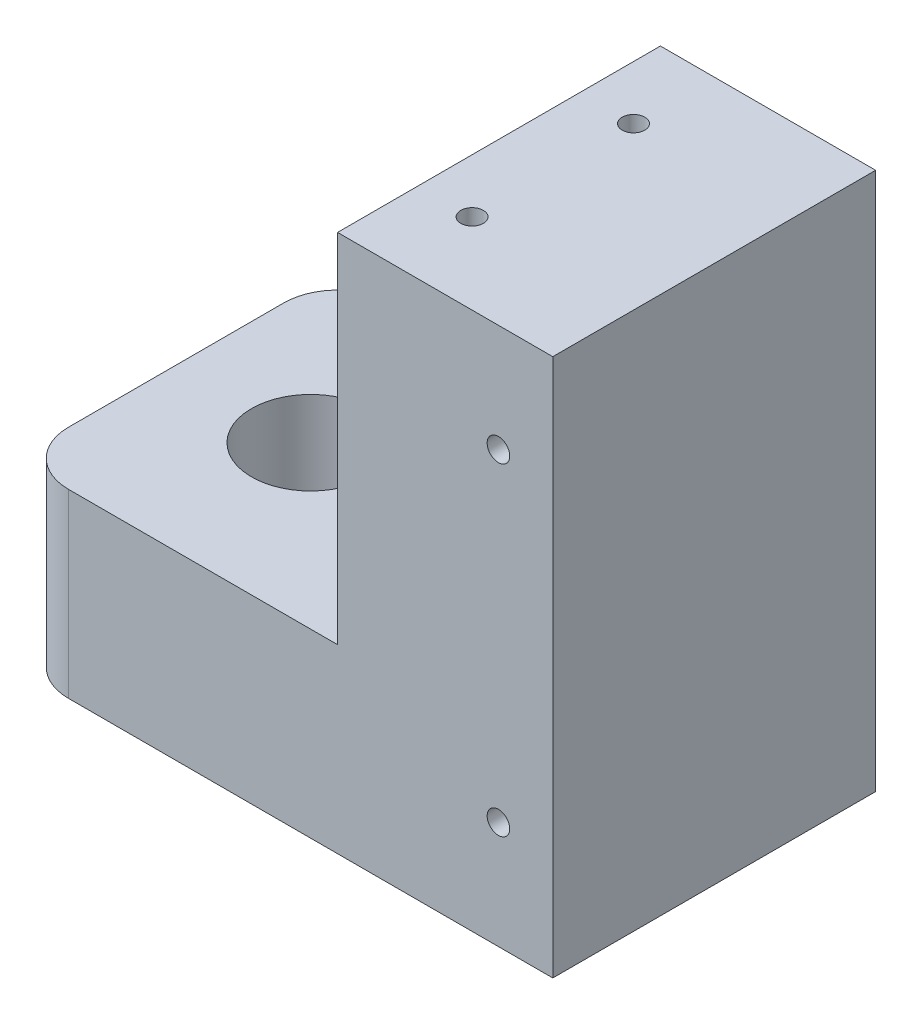
ISO-10303-21;
HEADER;
FILE_DESCRIPTION(('STEP AP214'),'2;1');
FILE_NAME('part.step','',(''),(''),'','','');
FILE_SCHEMA(('AUTOMOTIVE_DESIGN { 1 0 10303 214 1 1 1 1 }'));
ENDSEC;
DATA;
#1=APPLICATION_CONTEXT('core data for automotive mechanical design processes');
#2=APPLICATION_PROTOCOL_DEFINITION('international standard','automotive_design',2000,#1);
#3=PRODUCT_CONTEXT('',#1,'mechanical');
#4=PRODUCT('Part','Part','',(#3));
#5=PRODUCT_RELATED_PRODUCT_CATEGORY('part','',(#4));
#6=PRODUCT_DEFINITION_FORMATION('','',#4);
#7=PRODUCT_DEFINITION_CONTEXT('part definition',#1,'design');
#8=PRODUCT_DEFINITION('design','',#6,#7);
#9=PRODUCT_DEFINITION_SHAPE('','',#8);
#10=(LENGTH_UNIT() NAMED_UNIT(*) SI_UNIT(.MILLI.,.METRE.));
#11=(NAMED_UNIT(*) PLANE_ANGLE_UNIT() SI_UNIT($,.RADIAN.));
#12=(NAMED_UNIT(*) SI_UNIT($,.STERADIAN.) SOLID_ANGLE_UNIT());
#13=UNCERTAINTY_MEASURE_WITH_UNIT(LENGTH_MEASURE(1.E-05),#10,'distance_accuracy_value','');
#14=(GEOMETRIC_REPRESENTATION_CONTEXT(3) GLOBAL_UNCERTAINTY_ASSIGNED_CONTEXT((#13)) GLOBAL_UNIT_ASSIGNED_CONTEXT((#10,
#11,#12)) REPRESENTATION_CONTEXT('',''));
#15=CARTESIAN_POINT('',(0.,0.,0.));
#16=DIRECTION('',(0.,0.,1.));
#17=DIRECTION('',(1.,0.,0.));
#18=AXIS2_PLACEMENT_3D('',#15,#16,#17);
#19=CARTESIAN_POINT('',(25.,0.,-30.));
#20=DIRECTION('',(0.,1.,0.));
#21=DIRECTION('',(0.,0.,1.));
#22=AXIS2_PLACEMENT_3D('',#19,#20,#21);
#23=CYLINDRICAL_SURFACE('',#22,11.);
#24=CARTESIAN_POINT('',(25.,33.65,-30.));
#25=DIRECTION('',(0.,-1.,0.));
#26=DIRECTION('',(0.,0.,-1.));
#27=AXIS2_PLACEMENT_3D('',#24,#25,#26);
#28=CIRCLE('',#27,11.);
#29=CARTESIAN_POINT('',(25.,33.65,-41.));
#30=VERTEX_POINT('',#29);
#31=EDGE_CURVE('E232',#30,#30,#28,.T.);
#32=ORIENTED_EDGE('',*,*,#31,.F.);
#33=EDGE_LOOP('',(#32));
#34=FACE_BOUND('',#33,.T.);
#35=CARTESIAN_POINT('',(25.,10.65,-30.));
#36=DIRECTION('',(0.,-1.,0.));
#37=DIRECTION('',(0.,0.,-1.));
#38=AXIS2_PLACEMENT_3D('',#35,#36,#37);
#39=CIRCLE('',#38,11.);
#40=CARTESIAN_POINT('',(25.,10.65,-41.));
#41=VERTEX_POINT('',#40);
#42=EDGE_CURVE('E278',#41,#41,#39,.F.);
#43=ORIENTED_EDGE('',*,*,#42,.F.);
#44=EDGE_LOOP('',(#43));
#45=FACE_BOUND('',#44,.T.);
#46=ADVANCED_FACE('F45',(#34,#45),#23,.F.);
#47=CARTESIAN_POINT('',(0.,100.,0.));
#48=DIRECTION('',(1.,0.,0.));
#49=DIRECTION('',(0.,0.,-1.));
#50=AXIS2_PLACEMENT_3D('',#47,#48,#49);
#51=PLANE('',#50);
#52=DIRECTION('',(0.,0.,1.));
#53=VECTOR('',#52,1.);
#54=CARTESIAN_POINT('',(0.,0.,0.));
#55=LINE('',#54,#53);
#56=CARTESIAN_POINT('',(0.,0.,-50.));
#57=VERTEX_POINT('',#56);
#58=CARTESIAN_POINT('',(0.,0.,-10.));
#59=VERTEX_POINT('',#58);
#60=EDGE_CURVE('E245',#57,#59,#55,.T.);
#61=ORIENTED_EDGE('',*,*,#60,.T.);
#62=DIRECTION('',(0.,-1.,0.));
#63=VECTOR('',#62,1.);
#64=CARTESIAN_POINT('',(0.,100.,-10.));
#65=LINE('',#64,#63);
#66=CARTESIAN_POINT('',(0.,33.65,-9.99999999999999));
#67=VERTEX_POINT('',#66);
#68=EDGE_CURVE('E68',#59,#67,#65,.F.);
#69=ORIENTED_EDGE('',*,*,#68,.T.);
#70=DIRECTION('',(0.,0.,1.));
#71=VECTOR('',#70,1.);
#72=CARTESIAN_POINT('',(0.,33.65,-100.));
#73=LINE('',#72,#71);
#74=CARTESIAN_POINT('',(0.,33.65,-50.));
#75=VERTEX_POINT('',#74);
#76=EDGE_CURVE('E240',#75,#67,#73,.T.);
#77=ORIENTED_EDGE('',*,*,#76,.F.);
#78=DIRECTION('',(0.,1.,0.));
#79=VECTOR('',#78,1.);
#80=CARTESIAN_POINT('',(0.,100.,-50.));
#81=LINE('',#80,#79);
#82=EDGE_CURVE('E292',#75,#57,#81,.F.);
#83=ORIENTED_EDGE('',*,*,#82,.T.);
#84=EDGE_LOOP('',(#61,#69,#77,#83));
#85=FACE_BOUND('',#84,.T.);
#86=ADVANCED_FACE('F318',(#85),#51,.F.);
#87=CARTESIAN_POINT('',(0.,100.,0.));
#88=DIRECTION('',(0.,0.,-1.));
#89=DIRECTION('',(-1.,0.,0.));
#90=AXIS2_PLACEMENT_3D('',#87,#88,#89);
#91=PLANE('',#90);
#92=CARTESIAN_POINT('',(89.9,80.,0.));
#93=DIRECTION('',(0.,0.,1.));
#94=DIRECTION('',(1.,0.,0.));
#95=AXIS2_PLACEMENT_3D('',#92,#93,#94);
#96=CIRCLE('',#95,2.1);
#97=CARTESIAN_POINT('',(92.,80.,0.));
#98=VERTEX_POINT('',#97);
#99=EDGE_CURVE('E192',#98,#98,#96,.T.);
#100=ORIENTED_EDGE('',*,*,#99,.F.);
#101=EDGE_LOOP('',(#100));
#102=FACE_BOUND('',#101,.T.);
#103=CARTESIAN_POINT('',(89.9,20.,0.));
#104=DIRECTION('',(0.,0.,1.));
#105=DIRECTION('',(1.,0.,0.));
#106=AXIS2_PLACEMENT_3D('',#103,#104,#105);
#107=CIRCLE('',#106,2.1);
#108=CARTESIAN_POINT('',(92.,20.,0.));
#109=VERTEX_POINT('',#108);
#110=EDGE_CURVE('E200',#109,#109,#107,.T.);
#111=ORIENTED_EDGE('',*,*,#110,.F.);
#112=EDGE_LOOP('',(#111));
#113=FACE_BOUND('',#112,.T.);
#114=DIRECTION('',(1.,0.,0.));
#115=VECTOR('',#114,1.);
#116=CARTESIAN_POINT('',(0.,33.65,0.));
#117=LINE('',#116,#115);
#118=CARTESIAN_POINT('',(10.,33.65,0.));
#119=VERTEX_POINT('',#118);
#120=CARTESIAN_POINT('',(60.,33.65,0.));
#121=VERTEX_POINT('',#120);
#122=EDGE_CURVE('E233',#119,#121,#117,.T.);
#123=ORIENTED_EDGE('',*,*,#122,.F.);
#124=DIRECTION('',(0.,-1.,0.));
#125=VECTOR('',#124,1.);
#126=CARTESIAN_POINT('',(10.,100.,0.));
#127=LINE('',#126,#125);
#128=CARTESIAN_POINT('',(10.,0.,0.));
#129=VERTEX_POINT('',#128);
#130=EDGE_CURVE('E282',#119,#129,#127,.T.);
#131=ORIENTED_EDGE('',*,*,#130,.T.);
#132=DIRECTION('',(1.,0.,0.));
#133=VECTOR('',#132,1.);
#134=CARTESIAN_POINT('',(0.,0.,0.));
#135=LINE('',#134,#133);
#136=CARTESIAN_POINT('',(100.,0.,0.));
#137=VERTEX_POINT('',#136);
#138=EDGE_CURVE('E259',#129,#137,#135,.T.);
#139=ORIENTED_EDGE('',*,*,#138,.T.);
#140=DIRECTION('',(0.,-1.,0.));
#141=VECTOR('',#140,1.);
#142=CARTESIAN_POINT('',(100.,100.,0.));
#143=LINE('',#142,#141);
#144=CARTESIAN_POINT('',(100.,100.,0.));
#145=VERTEX_POINT('',#144);
#146=EDGE_CURVE('E256',#145,#137,#143,.T.);
#147=ORIENTED_EDGE('',*,*,#146,.F.);
#148=DIRECTION('',(1.,0.,0.));
#149=VECTOR('',#148,1.);
#150=CARTESIAN_POINT('',(0.,100.,0.));
#151=LINE('',#150,#149);
#152=CARTESIAN_POINT('',(60.,100.,0.));
#153=VERTEX_POINT('',#152);
#154=EDGE_CURVE('E248',#153,#145,#151,.T.);
#155=ORIENTED_EDGE('',*,*,#154,.F.);
#156=DIRECTION('',(0.,1.,0.));
#157=VECTOR('',#156,1.);
#158=CARTESIAN_POINT('',(60.,33.65,0.));
#159=LINE('',#158,#157);
#160=EDGE_CURVE('E236',#121,#153,#159,.T.);
#161=ORIENTED_EDGE('',*,*,#160,.F.);
#162=EDGE_LOOP('',(#123,#131,#139,#147,#155,#161));
#163=FACE_BOUND('',#162,.T.);
#164=ADVANCED_FACE('F308',(#102,#113,#163),#91,.F.);
#165=CARTESIAN_POINT('',(100.,100.,0.));
#166=DIRECTION('',(-1.,0.,0.));
#167=DIRECTION('',(0.,0.,1.));
#168=AXIS2_PLACEMENT_3D('',#165,#166,#167);
#169=PLANE('',#168);
#170=DIRECTION('',(0.,0.,-1.));
#171=VECTOR('',#170,1.);
#172=CARTESIAN_POINT('',(100.,0.,0.));
#173=LINE('',#172,#171);
#174=CARTESIAN_POINT('',(100.,0.,-60.));
#175=VERTEX_POINT('',#174);
#176=EDGE_CURVE('E252',#137,#175,#173,.T.);
#177=ORIENTED_EDGE('',*,*,#176,.T.);
#178=DIRECTION('',(0.,1.,0.));
#179=VECTOR('',#178,1.);
#180=CARTESIAN_POINT('',(100.,100.,-60.));
#181=LINE('',#180,#179);
#182=CARTESIAN_POINT('',(100.,100.,-60.));
#183=VERTEX_POINT('',#182);
#184=EDGE_CURVE('E213',#175,#183,#181,.T.);
#185=ORIENTED_EDGE('',*,*,#184,.T.);
#186=DIRECTION('',(0.,0.,-1.));
#187=VECTOR('',#186,1.);
#188=CARTESIAN_POINT('',(100.,100.,0.));
#189=LINE('',#188,#187);
#190=EDGE_CURVE('E251',#145,#183,#189,.T.);
#191=ORIENTED_EDGE('',*,*,#190,.F.);
#192=ORIENTED_EDGE('',*,*,#146,.T.);
#193=EDGE_LOOP('',(#177,#185,#191,#192));
#194=FACE_BOUND('',#193,.T.);
#195=ADVANCED_FACE('F324',(#194),#169,.F.);
#196=CARTESIAN_POINT('',(0.,100.,0.));
#197=DIRECTION('',(0.,-1.,0.));
#198=DIRECTION('',(0.,0.,-1.));
#199=AXIS2_PLACEMENT_3D('',#196,#197,#198);
#200=PLANE('',#199);
#201=CARTESIAN_POINT('',(70.,100.,-45.));
#202=DIRECTION('',(0.,1.,0.));
#203=DIRECTION('',(0.,0.,1.));
#204=AXIS2_PLACEMENT_3D('',#201,#202,#203);
#205=CIRCLE('',#204,2.09999999999999);
#206=CARTESIAN_POINT('',(70.,100.,-42.9));
#207=VERTEX_POINT('',#206);
#208=EDGE_CURVE('E160',#207,#207,#205,.T.);
#209=ORIENTED_EDGE('',*,*,#208,.F.);
#210=EDGE_LOOP('',(#209));
#211=FACE_BOUND('',#210,.T.);
#212=CARTESIAN_POINT('',(70.,100.,-15.));
#213=DIRECTION('',(0.,1.,0.));
#214=DIRECTION('',(0.,0.,1.));
#215=AXIS2_PLACEMENT_3D('',#212,#213,#214);
#216=CIRCLE('',#215,2.09999999999999);
#217=CARTESIAN_POINT('',(70.,100.,-12.9));
#218=VERTEX_POINT('',#217);
#219=EDGE_CURVE('E168',#218,#218,#216,.T.);
#220=ORIENTED_EDGE('',*,*,#219,.F.);
#221=EDGE_LOOP('',(#220));
#222=FACE_BOUND('',#221,.T.);
#223=ORIENTED_EDGE('',*,*,#190,.T.);
#224=DIRECTION('',(-1.,0.,0.));
#225=VECTOR('',#224,1.);
#226=CARTESIAN_POINT('',(100.,100.,-60.));
#227=LINE('',#226,#225);
#228=CARTESIAN_POINT('',(60.,100.,-60.));
#229=VERTEX_POINT('',#228);
#230=EDGE_CURVE('E221',#183,#229,#227,.T.);
#231=ORIENTED_EDGE('',*,*,#230,.T.);
#232=DIRECTION('',(0.,0.,1.));
#233=VECTOR('',#232,1.);
#234=CARTESIAN_POINT('',(60.,100.,0.));
#235=LINE('',#234,#233);
#236=EDGE_CURVE('E268',#229,#153,#235,.T.);
#237=ORIENTED_EDGE('',*,*,#236,.T.);
#238=ORIENTED_EDGE('',*,*,#154,.T.);
#239=EDGE_LOOP('',(#223,#231,#237,#238));
#240=FACE_BOUND('',#239,.T.);
#241=ADVANCED_FACE('F326',(#211,#222,#240),#200,.F.);
#242=CARTESIAN_POINT('',(0.,0.,0.));
#243=DIRECTION('',(0.,-1.,0.));
#244=DIRECTION('',(0.,0.,-1.));
#245=AXIS2_PLACEMENT_3D('',#242,#243,#244);
#246=PLANE('',#245);
#247=CARTESIAN_POINT('',(70.,0.,-15.));
#248=DIRECTION('',(0.,-1.,0.));
#249=DIRECTION('',(0.,0.,-1.));
#250=AXIS2_PLACEMENT_3D('',#247,#248,#249);
#251=CIRCLE('',#250,3.4);
#252=CARTESIAN_POINT('',(70.,0.,-18.4));
#253=VERTEX_POINT('',#252);
#254=EDGE_CURVE('E147',#253,#253,#251,.T.);
#255=ORIENTED_EDGE('',*,*,#254,.F.);
#256=EDGE_LOOP('',(#255));
#257=FACE_BOUND('',#256,.T.);
#258=CARTESIAN_POINT('',(70.,0.,-45.));
#259=DIRECTION('',(0.,-1.,0.));
#260=DIRECTION('',(0.,0.,-1.));
#261=AXIS2_PLACEMENT_3D('',#258,#259,#260);
#262=CIRCLE('',#261,3.4);
#263=CARTESIAN_POINT('',(70.,0.,-48.4));
#264=VERTEX_POINT('',#263);
#265=EDGE_CURVE('E146',#264,#264,#262,.T.);
#266=ORIENTED_EDGE('',*,*,#265,.F.);
#267=EDGE_LOOP('',(#266));
#268=FACE_BOUND('',#267,.T.);
#269=ORIENTED_EDGE('',*,*,#138,.F.);
#270=CARTESIAN_POINT('',(10.,0.,-10.));
#271=DIRECTION('',(0.,-1.,0.));
#272=DIRECTION('',(0.,0.,-1.));
#273=AXIS2_PLACEMENT_3D('',#270,#271,#272);
#274=CIRCLE('',#273,10.);
#275=EDGE_CURVE('E289',#129,#59,#274,.T.);
#276=ORIENTED_EDGE('',*,*,#275,.T.);
#277=ORIENTED_EDGE('',*,*,#60,.F.);
#278=CARTESIAN_POINT('',(9.99999999999999,0.,-50.));
#279=DIRECTION('',(0.,-1.,0.));
#280=DIRECTION('',(0.,0.,-1.));
#281=AXIS2_PLACEMENT_3D('',#278,#279,#280);
#282=CIRCLE('',#281,10.);
#283=CARTESIAN_POINT('',(9.99999999999999,0.,-60.));
#284=VERTEX_POINT('',#283);
#285=EDGE_CURVE('E286',#57,#284,#282,.T.);
#286=ORIENTED_EDGE('',*,*,#285,.T.);
#287=DIRECTION('',(-1.,0.,0.));
#288=VECTOR('',#287,1.);
#289=CARTESIAN_POINT('',(100.,0.,-60.));
#290=LINE('',#289,#288);
#291=EDGE_CURVE('E220',#175,#284,#290,.T.);
#292=ORIENTED_EDGE('',*,*,#291,.F.);
#293=ORIENTED_EDGE('',*,*,#176,.F.);
#294=EDGE_LOOP('',(#269,#276,#277,#286,#292,#293));
#295=FACE_BOUND('',#294,.T.);
#296=CARTESIAN_POINT('',(25.,0.,-30.));
#297=DIRECTION('',(0.,-1.,0.));
#298=DIRECTION('',(0.,0.,-1.));
#299=AXIS2_PLACEMENT_3D('',#296,#297,#298);
#300=CIRCLE('',#299,7.99999999999998);
#301=CARTESIAN_POINT('',(25.,0.,-38.));
#302=VERTEX_POINT('',#301);
#303=EDGE_CURVE('E208',#302,#302,#300,.T.);
#304=ORIENTED_EDGE('',*,*,#303,.F.);
#305=EDGE_LOOP('',(#304));
#306=FACE_BOUND('',#305,.T.);
#307=ADVANCED_FACE('F314',(#257,#268,#295,#306),#246,.T.);
#308=CARTESIAN_POINT('',(60.,33.65,-100.));
#309=DIRECTION('',(1.,0.,0.));
#310=DIRECTION('',(0.,0.,-1.));
#311=AXIS2_PLACEMENT_3D('',#308,#309,#310);
#312=PLANE('',#311);
#313=ORIENTED_EDGE('',*,*,#236,.F.);
#314=DIRECTION('',(0.,-1.,0.));
#315=VECTOR('',#314,1.);
#316=CARTESIAN_POINT('',(60.,33.65,-60.));
#317=LINE('',#316,#315);
#318=CARTESIAN_POINT('',(60.,33.65,-60.));
#319=VERTEX_POINT('',#318);
#320=EDGE_CURVE('E225',#229,#319,#317,.T.);
#321=ORIENTED_EDGE('',*,*,#320,.T.);
#322=DIRECTION('',(0.,0.,1.));
#323=VECTOR('',#322,1.);
#324=CARTESIAN_POINT('',(60.,33.65,-100.));
#325=LINE('',#324,#323);
#326=EDGE_CURVE('E241',#319,#121,#325,.T.);
#327=ORIENTED_EDGE('',*,*,#326,.T.);
#328=ORIENTED_EDGE('',*,*,#160,.T.);
#329=EDGE_LOOP('',(#313,#321,#327,#328));
#330=FACE_BOUND('',#329,.T.);
#331=ADVANCED_FACE('F330',(#330),#312,.F.);
#332=CARTESIAN_POINT('',(0.,33.65,-100.));
#333=DIRECTION('',(0.,-1.,0.));
#334=DIRECTION('',(0.,0.,-1.));
#335=AXIS2_PLACEMENT_3D('',#332,#333,#334);
#336=PLANE('',#335);
#337=ORIENTED_EDGE('',*,*,#31,.T.);
#338=EDGE_LOOP('',(#337));
#339=FACE_BOUND('',#338,.T.);
#340=ORIENTED_EDGE('',*,*,#76,.T.);
#341=CARTESIAN_POINT('',(10.,33.65,-10.));
#342=DIRECTION('',(0.,-1.,0.));
#343=DIRECTION('',(0.,0.,-1.));
#344=AXIS2_PLACEMENT_3D('',#341,#342,#343);
#345=CIRCLE('',#344,10.);
#346=EDGE_CURVE('E54',#67,#119,#345,.F.);
#347=ORIENTED_EDGE('',*,*,#346,.T.);
#348=ORIENTED_EDGE('',*,*,#122,.T.);
#349=ORIENTED_EDGE('',*,*,#326,.F.);
#350=DIRECTION('',(-1.,0.,0.));
#351=VECTOR('',#350,1.);
#352=CARTESIAN_POINT('',(0.,33.65,-60.));
#353=LINE('',#352,#351);
#354=CARTESIAN_POINT('',(9.99999999999999,33.65,-60.));
#355=VERTEX_POINT('',#354);
#356=EDGE_CURVE('E271',#319,#355,#353,.T.);
#357=ORIENTED_EDGE('',*,*,#356,.T.);
#358=CARTESIAN_POINT('',(9.99999999999999,33.65,-50.));
#359=DIRECTION('',(0.,-1.,0.));
#360=DIRECTION('',(0.,0.,-1.));
#361=AXIS2_PLACEMENT_3D('',#358,#359,#360);
#362=CIRCLE('',#361,10.);
#363=EDGE_CURVE('E61',#355,#75,#362,.F.);
#364=ORIENTED_EDGE('',*,*,#363,.T.);
#365=EDGE_LOOP('',(#340,#347,#348,#349,#357,#364));
#366=FACE_BOUND('',#365,.T.);
#367=ADVANCED_FACE('F302',(#339,#366),#336,.F.);
#368=CARTESIAN_POINT('',(100.,100.,-60.));
#369=DIRECTION('',(0.,0.,1.));
#370=DIRECTION('',(0.,-1.,0.));
#371=AXIS2_PLACEMENT_3D('',#368,#369,#370);
#372=PLANE('',#371);
#373=CARTESIAN_POINT('',(89.9,80.,-60.));
#374=DIRECTION('',(0.,0.,-1.));
#375=DIRECTION('',(-1.,0.,0.));
#376=AXIS2_PLACEMENT_3D('',#373,#374,#375);
#377=CIRCLE('',#376,2.1);
#378=CARTESIAN_POINT('',(87.8,80.,-60.));
#379=VERTEX_POINT('',#378);
#380=EDGE_CURVE('E176',#379,#379,#377,.T.);
#381=ORIENTED_EDGE('',*,*,#380,.F.);
#382=EDGE_LOOP('',(#381));
#383=FACE_BOUND('',#382,.T.);
#384=CARTESIAN_POINT('',(89.9,20.,-60.));
#385=DIRECTION('',(0.,0.,-1.));
#386=DIRECTION('',(-1.,0.,0.));
#387=AXIS2_PLACEMENT_3D('',#384,#385,#386);
#388=CIRCLE('',#387,2.1);
#389=CARTESIAN_POINT('',(87.8,20.,-60.));
#390=VERTEX_POINT('',#389);
#391=EDGE_CURVE('E184',#390,#390,#388,.T.);
#392=ORIENTED_EDGE('',*,*,#391,.F.);
#393=EDGE_LOOP('',(#392));
#394=FACE_BOUND('',#393,.T.);
#395=ORIENTED_EDGE('',*,*,#291,.T.);
#396=DIRECTION('',(0.,1.,0.));
#397=VECTOR('',#396,1.);
#398=CARTESIAN_POINT('',(9.99999999999999,100.,-60.));
#399=LINE('',#398,#397);
#400=EDGE_CURVE('E11',#284,#355,#399,.T.);
#401=ORIENTED_EDGE('',*,*,#400,.T.);
#402=ORIENTED_EDGE('',*,*,#356,.F.);
#403=ORIENTED_EDGE('',*,*,#320,.F.);
#404=ORIENTED_EDGE('',*,*,#230,.F.);
#405=ORIENTED_EDGE('',*,*,#184,.F.);
#406=EDGE_LOOP('',(#395,#401,#402,#403,#404,#405));
#407=FACE_BOUND('',#406,.T.);
#408=ADVANCED_FACE('F321',(#383,#394,#407),#372,.F.);
#409=CARTESIAN_POINT('',(25.,10.65,-30.));
#410=DIRECTION('',(0.,-1.,0.));
#411=DIRECTION('',(0.,0.,-1.));
#412=AXIS2_PLACEMENT_3D('',#409,#410,#411);
#413=PLANE('',#412);
#414=CARTESIAN_POINT('',(25.,10.65,-30.));
#415=DIRECTION('',(0.,-1.,0.));
#416=DIRECTION('',(0.,0.,-1.));
#417=AXIS2_PLACEMENT_3D('',#414,#415,#416);
#418=CIRCLE('',#417,7.99999999999998);
#419=CARTESIAN_POINT('',(25.,10.65,-38.));
#420=VERTEX_POINT('',#419);
#421=EDGE_CURVE('E209',#420,#420,#418,.T.);
#422=ORIENTED_EDGE('',*,*,#421,.T.);
#423=EDGE_LOOP('',(#422));
#424=FACE_BOUND('',#423,.T.);
#425=ORIENTED_EDGE('',*,*,#42,.T.);
#426=EDGE_LOOP('',(#425));
#427=FACE_BOUND('',#426,.T.);
#428=ADVANCED_FACE('F353',(#424,#427),#413,.F.);
#429=CARTESIAN_POINT('',(25.,10.65,-30.));
#430=DIRECTION('',(0.,-1.,0.));
#431=DIRECTION('',(0.,0.,-1.));
#432=AXIS2_PLACEMENT_3D('',#429,#430,#431);
#433=CYLINDRICAL_SURFACE('',#432,7.99999999999998);
#434=ORIENTED_EDGE('',*,*,#421,.F.);
#435=EDGE_LOOP('',(#434));
#436=FACE_BOUND('',#435,.T.);
#437=ORIENTED_EDGE('',*,*,#303,.T.);
#438=EDGE_LOOP('',(#437));
#439=FACE_BOUND('',#438,.T.);
#440=ADVANCED_FACE('F357',(#436,#439),#433,.F.);
#441=CARTESIAN_POINT('',(89.9,20.,-15.));
#442=DIRECTION('',(0.,0.,1.));
#443=DIRECTION('',(1.,0.,0.));
#444=AXIS2_PLACEMENT_3D('',#441,#442,#443);
#445=CONICAL_SURFACE('',#444,2.09999999999999,1.02974425867665);
#446=CARTESIAN_POINT('',(89.9,20.,-16.2618072999579));
#447=VERTEX_POINT('',#446);
#448=VERTEX_LOOP('',#447);
#449=FACE_BOUND('',#448,.T.);
#450=CARTESIAN_POINT('',(89.9,20.,-15.));
#451=DIRECTION('',(0.,0.,1.));
#452=DIRECTION('',(1.,0.,0.));
#453=AXIS2_PLACEMENT_3D('',#450,#451,#452);
#454=CIRCLE('',#453,2.09999999999999);
#455=CARTESIAN_POINT('',(92.,20.,-15.));
#456=VERTEX_POINT('',#455);
#457=EDGE_CURVE('E204',#456,#456,#454,.T.);
#458=ORIENTED_EDGE('',*,*,#457,.T.);
#459=EDGE_LOOP('',(#458));
#460=FACE_BOUND('',#459,.T.);
#461=ADVANCED_FACE('F361',(#449,#460),#445,.F.);
#462=CARTESIAN_POINT('',(89.9,20.,0.));
#463=DIRECTION('',(0.,0.,1.));
#464=DIRECTION('',(1.,0.,0.));
#465=AXIS2_PLACEMENT_3D('',#462,#463,#464);
#466=CYLINDRICAL_SURFACE('',#465,2.1);
#467=ORIENTED_EDGE('',*,*,#457,.F.);
#468=EDGE_LOOP('',(#467));
#469=FACE_BOUND('',#468,.T.);
#470=ORIENTED_EDGE('',*,*,#110,.T.);
#471=EDGE_LOOP('',(#470));
#472=FACE_BOUND('',#471,.T.);
#473=ADVANCED_FACE('F365',(#469,#472),#466,.F.);
#474=CARTESIAN_POINT('',(89.9,80.,-15.));
#475=DIRECTION('',(0.,0.,1.));
#476=DIRECTION('',(1.,0.,0.));
#477=AXIS2_PLACEMENT_3D('',#474,#475,#476);
#478=CONICAL_SURFACE('',#477,2.09999999999999,1.02974425867665);
#479=CARTESIAN_POINT('',(89.9,80.,-16.2618072999579));
#480=VERTEX_POINT('',#479);
#481=VERTEX_LOOP('',#480);
#482=FACE_BOUND('',#481,.T.);
#483=CARTESIAN_POINT('',(89.9,80.,-15.));
#484=DIRECTION('',(0.,0.,1.));
#485=DIRECTION('',(1.,0.,0.));
#486=AXIS2_PLACEMENT_3D('',#483,#484,#485);
#487=CIRCLE('',#486,2.09999999999999);
#488=CARTESIAN_POINT('',(92.,80.,-15.));
#489=VERTEX_POINT('',#488);
#490=EDGE_CURVE('E196',#489,#489,#487,.T.);
#491=ORIENTED_EDGE('',*,*,#490,.T.);
#492=EDGE_LOOP('',(#491));
#493=FACE_BOUND('',#492,.T.);
#494=ADVANCED_FACE('F369',(#482,#493),#478,.F.);
#495=CARTESIAN_POINT('',(89.9,80.,0.));
#496=DIRECTION('',(0.,0.,1.));
#497=DIRECTION('',(1.,0.,0.));
#498=AXIS2_PLACEMENT_3D('',#495,#496,#497);
#499=CYLINDRICAL_SURFACE('',#498,2.1);
#500=ORIENTED_EDGE('',*,*,#490,.F.);
#501=EDGE_LOOP('',(#500));
#502=FACE_BOUND('',#501,.T.);
#503=ORIENTED_EDGE('',*,*,#99,.T.);
#504=EDGE_LOOP('',(#503));
#505=FACE_BOUND('',#504,.T.);
#506=ADVANCED_FACE('F373',(#502,#505),#499,.F.);
#507=CARTESIAN_POINT('',(89.9,20.,-45.));
#508=DIRECTION('',(0.,0.,-1.));
#509=DIRECTION('',(-1.,0.,0.));
#510=AXIS2_PLACEMENT_3D('',#507,#508,#509);
#511=CONICAL_SURFACE('',#510,2.09999999999999,1.02974425867665);
#512=CARTESIAN_POINT('',(89.9,20.,-43.7381927000421));
#513=VERTEX_POINT('',#512);
#514=VERTEX_LOOP('',#513);
#515=FACE_BOUND('',#514,.T.);
#516=CARTESIAN_POINT('',(89.9,20.,-45.));
#517=DIRECTION('',(0.,0.,-1.));
#518=DIRECTION('',(-1.,0.,0.));
#519=AXIS2_PLACEMENT_3D('',#516,#517,#518);
#520=CIRCLE('',#519,2.09999999999999);
#521=CARTESIAN_POINT('',(87.8,20.,-45.));
#522=VERTEX_POINT('',#521);
#523=EDGE_CURVE('E188',#522,#522,#520,.T.);
#524=ORIENTED_EDGE('',*,*,#523,.T.);
#525=EDGE_LOOP('',(#524));
#526=FACE_BOUND('',#525,.T.);
#527=ADVANCED_FACE('F377',(#515,#526),#511,.F.);
#528=CARTESIAN_POINT('',(89.9,20.,-60.));
#529=DIRECTION('',(0.,0.,-1.));
#530=DIRECTION('',(-1.,0.,0.));
#531=AXIS2_PLACEMENT_3D('',#528,#529,#530);
#532=CYLINDRICAL_SURFACE('',#531,2.1);
#533=ORIENTED_EDGE('',*,*,#523,.F.);
#534=EDGE_LOOP('',(#533));
#535=FACE_BOUND('',#534,.T.);
#536=ORIENTED_EDGE('',*,*,#391,.T.);
#537=EDGE_LOOP('',(#536));
#538=FACE_BOUND('',#537,.T.);
#539=ADVANCED_FACE('F381',(#535,#538),#532,.F.);
#540=CARTESIAN_POINT('',(89.9,80.,-45.));
#541=DIRECTION('',(0.,0.,-1.));
#542=DIRECTION('',(-1.,0.,0.));
#543=AXIS2_PLACEMENT_3D('',#540,#541,#542);
#544=CONICAL_SURFACE('',#543,2.09999999999999,1.02974425867665);
#545=CARTESIAN_POINT('',(89.9,80.,-43.7381927000421));
#546=VERTEX_POINT('',#545);
#547=VERTEX_LOOP('',#546);
#548=FACE_BOUND('',#547,.T.);
#549=CARTESIAN_POINT('',(89.9,80.,-45.));
#550=DIRECTION('',(0.,0.,-1.));
#551=DIRECTION('',(-1.,0.,0.));
#552=AXIS2_PLACEMENT_3D('',#549,#550,#551);
#553=CIRCLE('',#552,2.09999999999999);
#554=CARTESIAN_POINT('',(87.8,80.,-45.));
#555=VERTEX_POINT('',#554);
#556=EDGE_CURVE('E180',#555,#555,#553,.T.);
#557=ORIENTED_EDGE('',*,*,#556,.T.);
#558=EDGE_LOOP('',(#557));
#559=FACE_BOUND('',#558,.T.);
#560=ADVANCED_FACE('F385',(#548,#559),#544,.F.);
#561=CARTESIAN_POINT('',(89.9,80.,-60.));
#562=DIRECTION('',(0.,0.,-1.));
#563=DIRECTION('',(-1.,0.,0.));
#564=AXIS2_PLACEMENT_3D('',#561,#562,#563);
#565=CYLINDRICAL_SURFACE('',#564,2.1);
#566=ORIENTED_EDGE('',*,*,#556,.F.);
#567=EDGE_LOOP('',(#566));
#568=FACE_BOUND('',#567,.T.);
#569=ORIENTED_EDGE('',*,*,#380,.T.);
#570=EDGE_LOOP('',(#569));
#571=FACE_BOUND('',#570,.T.);
#572=ADVANCED_FACE('F389',(#568,#571),#565,.F.);
#573=CARTESIAN_POINT('',(70.,78.,-15.));
#574=DIRECTION('',(0.,1.,0.));
#575=DIRECTION('',(0.,0.,1.));
#576=AXIS2_PLACEMENT_3D('',#573,#574,#575);
#577=CONICAL_SURFACE('',#576,2.09999999999999,1.02974425867665);
#578=CARTESIAN_POINT('',(70.,76.7381927000421,-15.));
#579=VERTEX_POINT('',#578);
#580=VERTEX_LOOP('',#579);
#581=FACE_BOUND('',#580,.T.);
#582=CARTESIAN_POINT('',(70.,78.,-15.));
#583=DIRECTION('',(0.,1.,0.));
#584=DIRECTION('',(0.,0.,1.));
#585=AXIS2_PLACEMENT_3D('',#582,#583,#584);
#586=CIRCLE('',#585,2.09999999999999);
#587=CARTESIAN_POINT('',(70.,78.,-12.9));
#588=VERTEX_POINT('',#587);
#589=EDGE_CURVE('E172',#588,#588,#586,.T.);
#590=ORIENTED_EDGE('',*,*,#589,.T.);
#591=EDGE_LOOP('',(#590));
#592=FACE_BOUND('',#591,.T.);
#593=ADVANCED_FACE('F393',(#581,#592),#577,.F.);
#594=CARTESIAN_POINT('',(70.,100.,-15.));
#595=DIRECTION('',(0.,1.,0.));
#596=DIRECTION('',(0.,0.,1.));
#597=AXIS2_PLACEMENT_3D('',#594,#595,#596);
#598=CYLINDRICAL_SURFACE('',#597,2.09999999999999);
#599=ORIENTED_EDGE('',*,*,#589,.F.);
#600=EDGE_LOOP('',(#599));
#601=FACE_BOUND('',#600,.T.);
#602=ORIENTED_EDGE('',*,*,#219,.T.);
#603=EDGE_LOOP('',(#602));
#604=FACE_BOUND('',#603,.T.);
#605=ADVANCED_FACE('F397',(#601,#604),#598,.F.);
#606=CARTESIAN_POINT('',(70.,78.,-45.));
#607=DIRECTION('',(0.,1.,0.));
#608=DIRECTION('',(0.,0.,1.));
#609=AXIS2_PLACEMENT_3D('',#606,#607,#608);
#610=CONICAL_SURFACE('',#609,2.09999999999999,1.02974425867665);
#611=CARTESIAN_POINT('',(70.,76.7381927000421,-45.));
#612=VERTEX_POINT('',#611);
#613=VERTEX_LOOP('',#612);
#614=FACE_BOUND('',#613,.T.);
#615=CARTESIAN_POINT('',(70.,78.,-45.));
#616=DIRECTION('',(0.,1.,0.));
#617=DIRECTION('',(0.,0.,1.));
#618=AXIS2_PLACEMENT_3D('',#615,#616,#617);
#619=CIRCLE('',#618,2.09999999999999);
#620=CARTESIAN_POINT('',(70.,78.,-42.9));
#621=VERTEX_POINT('',#620);
#622=EDGE_CURVE('E164',#621,#621,#619,.T.);
#623=ORIENTED_EDGE('',*,*,#622,.T.);
#624=EDGE_LOOP('',(#623));
#625=FACE_BOUND('',#624,.T.);
#626=ADVANCED_FACE('F401',(#614,#625),#610,.F.);
#627=CARTESIAN_POINT('',(70.,100.,-45.));
#628=DIRECTION('',(0.,1.,0.));
#629=DIRECTION('',(0.,0.,1.));
#630=AXIS2_PLACEMENT_3D('',#627,#628,#629);
#631=CYLINDRICAL_SURFACE('',#630,2.09999999999999);
#632=ORIENTED_EDGE('',*,*,#622,.F.);
#633=EDGE_LOOP('',(#632));
#634=FACE_BOUND('',#633,.T.);
#635=ORIENTED_EDGE('',*,*,#208,.T.);
#636=EDGE_LOOP('',(#635));
#637=FACE_BOUND('',#636,.T.);
#638=ADVANCED_FACE('F405',(#634,#637),#631,.F.);
#639=CARTESIAN_POINT('',(70.,24.25,-45.));
#640=DIRECTION('',(0.,-1.,0.));
#641=DIRECTION('',(0.,0.,-1.));
#642=AXIS2_PLACEMENT_3D('',#639,#640,#641);
#643=CONICAL_SURFACE('',#642,3.4,1.02974425867665);
#644=CARTESIAN_POINT('',(70.,26.2929261046937,-45.));
#645=VERTEX_POINT('',#644);
#646=VERTEX_LOOP('',#645);
#647=FACE_BOUND('',#646,.T.);
#648=CARTESIAN_POINT('',(70.,24.25,-45.));
#649=DIRECTION('',(0.,-1.,0.));
#650=DIRECTION('',(0.,0.,-1.));
#651=AXIS2_PLACEMENT_3D('',#648,#649,#650);
#652=CIRCLE('',#651,3.4);
#653=CARTESIAN_POINT('',(70.,24.25,-48.4));
#654=VERTEX_POINT('',#653);
#655=EDGE_CURVE('E152',#654,#654,#652,.T.);
#656=ORIENTED_EDGE('',*,*,#655,.T.);
#657=EDGE_LOOP('',(#656));
#658=FACE_BOUND('',#657,.T.);
#659=ADVANCED_FACE('F409',(#647,#658),#643,.F.);
#660=CARTESIAN_POINT('',(70.,0.,-45.));
#661=DIRECTION('',(0.,-1.,0.));
#662=DIRECTION('',(0.,0.,-1.));
#663=AXIS2_PLACEMENT_3D('',#660,#661,#662);
#664=CYLINDRICAL_SURFACE('',#663,3.4);
#665=ORIENTED_EDGE('',*,*,#655,.F.);
#666=EDGE_LOOP('',(#665));
#667=FACE_BOUND('',#666,.T.);
#668=ORIENTED_EDGE('',*,*,#265,.T.);
#669=EDGE_LOOP('',(#668));
#670=FACE_BOUND('',#669,.T.);
#671=ADVANCED_FACE('F139',(#667,#670),#664,.F.);
#672=CARTESIAN_POINT('',(70.,24.25,-15.));
#673=DIRECTION('',(0.,-1.,0.));
#674=DIRECTION('',(0.,0.,-1.));
#675=AXIS2_PLACEMENT_3D('',#672,#673,#674);
#676=CONICAL_SURFACE('',#675,3.4,1.02974425867665);
#677=CARTESIAN_POINT('',(70.,26.2929261046937,-15.));
#678=VERTEX_POINT('',#677);
#679=VERTEX_LOOP('',#678);
#680=FACE_BOUND('',#679,.T.);
#681=CARTESIAN_POINT('',(70.,24.25,-15.));
#682=DIRECTION('',(0.,-1.,0.));
#683=DIRECTION('',(0.,0.,-1.));
#684=AXIS2_PLACEMENT_3D('',#681,#682,#683);
#685=CIRCLE('',#684,3.4);
#686=CARTESIAN_POINT('',(70.,24.25,-18.4));
#687=VERTEX_POINT('',#686);
#688=EDGE_CURVE('E143',#687,#687,#685,.T.);
#689=ORIENTED_EDGE('',*,*,#688,.T.);
#690=EDGE_LOOP('',(#689));
#691=FACE_BOUND('',#690,.T.);
#692=ADVANCED_FACE('F135',(#680,#691),#676,.F.);
#693=CARTESIAN_POINT('',(70.,0.,-15.));
#694=DIRECTION('',(0.,-1.,0.));
#695=DIRECTION('',(0.,0.,-1.));
#696=AXIS2_PLACEMENT_3D('',#693,#694,#695);
#697=CYLINDRICAL_SURFACE('',#696,3.4);
#698=ORIENTED_EDGE('',*,*,#688,.F.);
#699=EDGE_LOOP('',(#698));
#700=FACE_BOUND('',#699,.T.);
#701=ORIENTED_EDGE('',*,*,#254,.T.);
#702=EDGE_LOOP('',(#701));
#703=FACE_BOUND('',#702,.T.);
#704=ADVANCED_FACE('F138',(#700,#703),#697,.F.);
#705=CARTESIAN_POINT('',(10.,100.,-10.));
#706=DIRECTION('',(0.,-1.,0.));
#707=DIRECTION('',(0.,0.,-1.));
#708=AXIS2_PLACEMENT_3D('',#705,#706,#707);
#709=CYLINDRICAL_SURFACE('',#708,10.);
#710=ORIENTED_EDGE('',*,*,#346,.F.);
#711=ORIENTED_EDGE('',*,*,#68,.F.);
#712=ORIENTED_EDGE('',*,*,#275,.F.);
#713=ORIENTED_EDGE('',*,*,#130,.F.);
#714=EDGE_LOOP('',(#710,#711,#712,#713));
#715=FACE_BOUND('',#714,.T.);
#716=ADVANCED_FACE('F311',(#715),#709,.T.);
#717=CARTESIAN_POINT('',(9.99999999999999,100.,-50.));
#718=DIRECTION('',(0.,1.,0.));
#719=DIRECTION('',(0.,0.,1.));
#720=AXIS2_PLACEMENT_3D('',#717,#718,#719);
#721=CYLINDRICAL_SURFACE('',#720,10.);
#722=ORIENTED_EDGE('',*,*,#285,.F.);
#723=ORIENTED_EDGE('',*,*,#82,.F.);
#724=ORIENTED_EDGE('',*,*,#363,.F.);
#725=ORIENTED_EDGE('',*,*,#400,.F.);
#726=EDGE_LOOP('',(#722,#723,#724,#725));
#727=FACE_BOUND('',#726,.T.);
#728=ADVANCED_FACE('F47',(#727),#721,.T.);
#729=CLOSED_SHELL('',(#46,#86,#164,#195,#241,#307,#331,#367,#408,#428,#440,#461,#473,#494,#506,
#527,#539,#560,#572,#593,#605,#626,#638,#659,#671,#692,#704,#716,#728));
#730=MANIFOLD_SOLID_BREP('B2',#729);
#731=ADVANCED_BREP_SHAPE_REPRESENTATION('',(#18,#730),#14);
#732=SHAPE_DEFINITION_REPRESENTATION(#9,#731);
ENDSEC;
END-ISO-10303-21;
